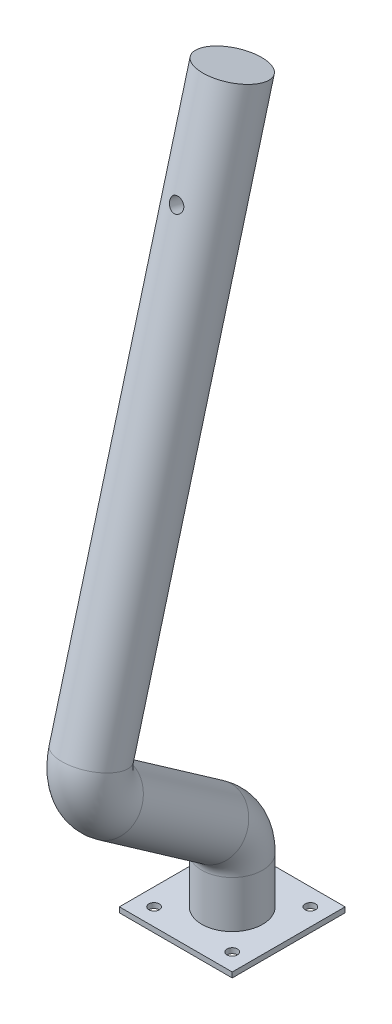
ISO-10303-21;
HEADER;
FILE_DESCRIPTION(('STEP AP214'),'2;1');
FILE_NAME('part.step','',(''),(''),'','','');
FILE_SCHEMA(('AUTOMOTIVE_DESIGN { 1 0 10303 214 1 1 1 1 }'));
ENDSEC;
DATA;
#1=APPLICATION_CONTEXT('core data for automotive mechanical design processes');
#2=APPLICATION_PROTOCOL_DEFINITION('international standard','automotive_design',2000,#1);
#3=PRODUCT_CONTEXT('',#1,'mechanical');
#4=PRODUCT('Part','Part','',(#3));
#5=PRODUCT_RELATED_PRODUCT_CATEGORY('part','',(#4));
#6=PRODUCT_DEFINITION_FORMATION('','',#4);
#7=PRODUCT_DEFINITION_CONTEXT('part definition',#1,'design');
#8=PRODUCT_DEFINITION('design','',#6,#7);
#9=PRODUCT_DEFINITION_SHAPE('','',#8);
#10=(LENGTH_UNIT() NAMED_UNIT(*) SI_UNIT(.MILLI.,.METRE.));
#11=(NAMED_UNIT(*) PLANE_ANGLE_UNIT() SI_UNIT($,.RADIAN.));
#12=(NAMED_UNIT(*) SI_UNIT($,.STERADIAN.) SOLID_ANGLE_UNIT());
#13=UNCERTAINTY_MEASURE_WITH_UNIT(LENGTH_MEASURE(1.E-05),#10,'distance_accuracy_value','');
#14=(GEOMETRIC_REPRESENTATION_CONTEXT(3) GLOBAL_UNCERTAINTY_ASSIGNED_CONTEXT((#13)) GLOBAL_UNIT_ASSIGNED_CONTEXT((#10,
#11,#12)) REPRESENTATION_CONTEXT('',''));
#15=CARTESIAN_POINT('',(0.,0.,0.));
#16=DIRECTION('',(0.,0.,1.));
#17=DIRECTION('',(1.,0.,0.));
#18=AXIS2_PLACEMENT_3D('',#15,#16,#17);
#19=CARTESIAN_POINT('',(0.,3.,0.));
#20=DIRECTION('',(0.,-1.,0.));
#21=DIRECTION('',(0.,0.,-1.));
#22=AXIS2_PLACEMENT_3D('',#19,#20,#21);
#23=PLANE('',#22);
#24=CARTESIAN_POINT('',(0.,3.,0.));
#25=DIRECTION('',(0.,-1.,0.));
#26=DIRECTION('',(0.,0.,-1.));
#27=AXIS2_PLACEMENT_3D('',#24,#25,#26);
#28=CIRCLE('',#27,17.5);
#29=CARTESIAN_POINT('',(0.,3.,-17.5));
#30=VERTEX_POINT('',#29);
#31=EDGE_CURVE('E12',#30,#30,#28,.F.);
#32=ORIENTED_EDGE('',*,*,#31,.F.);
#33=EDGE_LOOP('',(#32));
#34=FACE_BOUND('',#33,.T.);
#35=DIRECTION('',(0.,0.,-1.));
#36=VECTOR('',#35,1.);
#37=CARTESIAN_POINT('',(32.5,3.,32.5));
#38=LINE('',#37,#36);
#39=CARTESIAN_POINT('',(32.5,3.,32.5));
#40=VERTEX_POINT('',#39);
#41=CARTESIAN_POINT('',(32.5,3.,-32.5));
#42=VERTEX_POINT('',#41);
#43=EDGE_CURVE('E142',#40,#42,#38,.T.);
#44=ORIENTED_EDGE('',*,*,#43,.T.);
#45=DIRECTION('',(-1.,0.,0.));
#46=VECTOR('',#45,1.);
#47=CARTESIAN_POINT('',(-32.5,3.,-32.5));
#48=LINE('',#47,#46);
#49=CARTESIAN_POINT('',(-32.5,3.,-32.5));
#50=VERTEX_POINT('',#49);
#51=EDGE_CURVE('E101',#42,#50,#48,.T.);
#52=ORIENTED_EDGE('',*,*,#51,.T.);
#53=DIRECTION('',(0.,0.,1.));
#54=VECTOR('',#53,1.);
#55=CARTESIAN_POINT('',(-32.5,3.,32.5));
#56=LINE('',#55,#54);
#57=CARTESIAN_POINT('',(-32.5,3.,32.5));
#58=VERTEX_POINT('',#57);
#59=EDGE_CURVE('E145',#50,#58,#56,.T.);
#60=ORIENTED_EDGE('',*,*,#59,.T.);
#61=DIRECTION('',(1.,0.,0.));
#62=VECTOR('',#61,1.);
#63=CARTESIAN_POINT('',(-32.5,3.,32.5));
#64=LINE('',#63,#62);
#65=EDGE_CURVE('E69',#58,#40,#64,.T.);
#66=ORIENTED_EDGE('',*,*,#65,.T.);
#67=EDGE_LOOP('',(#44,#52,#60,#66));
#68=FACE_BOUND('',#67,.T.);
#69=CARTESIAN_POINT('',(22.5,3.,22.5));
#70=DIRECTION('',(0.,1.,0.));
#71=DIRECTION('',(0.,0.,1.));
#72=AXIS2_PLACEMENT_3D('',#69,#70,#71);
#73=CIRCLE('',#72,3.);
#74=CARTESIAN_POINT('',(22.5,3.,25.5));
#75=VERTEX_POINT('',#74);
#76=EDGE_CURVE('E136',#75,#75,#73,.T.);
#77=ORIENTED_EDGE('',*,*,#76,.F.);
#78=EDGE_LOOP('',(#77));
#79=FACE_BOUND('',#78,.T.);
#80=CARTESIAN_POINT('',(-22.5,3.,22.5));
#81=DIRECTION('',(0.,1.,0.));
#82=DIRECTION('',(0.,0.,1.));
#83=AXIS2_PLACEMENT_3D('',#80,#81,#82);
#84=CIRCLE('',#83,3.);
#85=CARTESIAN_POINT('',(-22.5,3.,25.5));
#86=VERTEX_POINT('',#85);
#87=EDGE_CURVE('E130',#86,#86,#84,.T.);
#88=ORIENTED_EDGE('',*,*,#87,.F.);
#89=EDGE_LOOP('',(#88));
#90=FACE_BOUND('',#89,.T.);
#91=CARTESIAN_POINT('',(-22.5,3.,-22.5));
#92=DIRECTION('',(0.,1.,0.));
#93=DIRECTION('',(0.,0.,1.));
#94=AXIS2_PLACEMENT_3D('',#91,#92,#93);
#95=CIRCLE('',#94,3.);
#96=CARTESIAN_POINT('',(-22.5,3.,-19.5));
#97=VERTEX_POINT('',#96);
#98=EDGE_CURVE('E124',#97,#97,#95,.T.);
#99=ORIENTED_EDGE('',*,*,#98,.F.);
#100=EDGE_LOOP('',(#99));
#101=FACE_BOUND('',#100,.T.);
#102=CARTESIAN_POINT('',(22.5,3.,-22.5));
#103=DIRECTION('',(0.,1.,0.));
#104=DIRECTION('',(0.,0.,1.));
#105=AXIS2_PLACEMENT_3D('',#102,#103,#104);
#106=CIRCLE('',#105,3.);
#107=CARTESIAN_POINT('',(22.5,3.,-19.5));
#108=VERTEX_POINT('',#107);
#109=EDGE_CURVE('E114',#108,#108,#106,.T.);
#110=ORIENTED_EDGE('',*,*,#109,.F.);
#111=EDGE_LOOP('',(#110));
#112=FACE_BOUND('',#111,.T.);
#113=ADVANCED_FACE('F47',(#34,#68,#79,#90,#101,#112),#23,.F.);
#114=CARTESIAN_POINT('',(0.,0.,0.));
#115=DIRECTION('',(0.,-1.,0.));
#116=DIRECTION('',(0.,0.,-1.));
#117=AXIS2_PLACEMENT_3D('',#114,#115,#116);
#118=PLANE('',#117);
#119=CARTESIAN_POINT('',(-22.5,0.,-22.5));
#120=DIRECTION('',(0.,1.,0.));
#121=DIRECTION('',(0.,0.,1.));
#122=AXIS2_PLACEMENT_3D('',#119,#120,#121);
#123=CIRCLE('',#122,3.);
#124=CARTESIAN_POINT('',(-22.5,0.,-19.5));
#125=VERTEX_POINT('',#124);
#126=EDGE_CURVE('E122',#125,#125,#123,.T.);
#127=ORIENTED_EDGE('',*,*,#126,.T.);
#128=EDGE_LOOP('',(#127));
#129=FACE_BOUND('',#128,.T.);
#130=CARTESIAN_POINT('',(22.5,0.,22.5));
#131=DIRECTION('',(0.,1.,0.));
#132=DIRECTION('',(0.,0.,1.));
#133=AXIS2_PLACEMENT_3D('',#130,#131,#132);
#134=CIRCLE('',#133,3.);
#135=CARTESIAN_POINT('',(22.5,0.,25.5));
#136=VERTEX_POINT('',#135);
#137=EDGE_CURVE('E133',#136,#136,#134,.T.);
#138=ORIENTED_EDGE('',*,*,#137,.T.);
#139=EDGE_LOOP('',(#138));
#140=FACE_BOUND('',#139,.T.);
#141=DIRECTION('',(0.,0.,-1.));
#142=VECTOR('',#141,1.);
#143=CARTESIAN_POINT('',(32.5,0.,32.5));
#144=LINE('',#143,#142);
#145=CARTESIAN_POINT('',(32.5,0.,32.5));
#146=VERTEX_POINT('',#145);
#147=CARTESIAN_POINT('',(32.5,0.,-32.5));
#148=VERTEX_POINT('',#147);
#149=EDGE_CURVE('E139',#146,#148,#144,.T.);
#150=ORIENTED_EDGE('',*,*,#149,.F.);
#151=DIRECTION('',(1.,0.,0.));
#152=VECTOR('',#151,1.);
#153=CARTESIAN_POINT('',(-32.5,0.,32.5));
#154=LINE('',#153,#152);
#155=CARTESIAN_POINT('',(-32.5,0.,32.5));
#156=VERTEX_POINT('',#155);
#157=EDGE_CURVE('E93',#156,#146,#154,.T.);
#158=ORIENTED_EDGE('',*,*,#157,.F.);
#159=DIRECTION('',(0.,0.,1.));
#160=VECTOR('',#159,1.);
#161=CARTESIAN_POINT('',(-32.5,0.,32.5));
#162=LINE('',#161,#160);
#163=CARTESIAN_POINT('',(-32.5,0.,-32.5));
#164=VERTEX_POINT('',#163);
#165=EDGE_CURVE('E87',#164,#156,#162,.T.);
#166=ORIENTED_EDGE('',*,*,#165,.F.);
#167=DIRECTION('',(-1.,0.,0.));
#168=VECTOR('',#167,1.);
#169=CARTESIAN_POINT('',(-32.5,0.,-32.5));
#170=LINE('',#169,#168);
#171=EDGE_CURVE('E151',#148,#164,#170,.T.);
#172=ORIENTED_EDGE('',*,*,#171,.F.);
#173=EDGE_LOOP('',(#150,#158,#166,#172));
#174=FACE_BOUND('',#173,.T.);
#175=CARTESIAN_POINT('',(-22.5,0.,22.5));
#176=DIRECTION('',(0.,1.,0.));
#177=DIRECTION('',(0.,0.,1.));
#178=AXIS2_PLACEMENT_3D('',#175,#176,#177);
#179=CIRCLE('',#178,3.);
#180=CARTESIAN_POINT('',(-22.5,0.,25.5));
#181=VERTEX_POINT('',#180);
#182=EDGE_CURVE('E127',#181,#181,#179,.T.);
#183=ORIENTED_EDGE('',*,*,#182,.T.);
#184=EDGE_LOOP('',(#183));
#185=FACE_BOUND('',#184,.T.);
#186=CARTESIAN_POINT('',(22.5,0.,-22.5));
#187=DIRECTION('',(0.,1.,0.));
#188=DIRECTION('',(0.,0.,1.));
#189=AXIS2_PLACEMENT_3D('',#186,#187,#188);
#190=CIRCLE('',#189,3.);
#191=CARTESIAN_POINT('',(22.5,0.,-19.5));
#192=VERTEX_POINT('',#191);
#193=EDGE_CURVE('E110',#192,#192,#190,.T.);
#194=ORIENTED_EDGE('',*,*,#193,.T.);
#195=EDGE_LOOP('',(#194));
#196=FACE_BOUND('',#195,.T.);
#197=ADVANCED_FACE('F166',(#129,#140,#174,#185,#196),#118,.T.);
#198=CARTESIAN_POINT('',(32.5,3.,32.5));
#199=DIRECTION('',(-1.,0.,0.));
#200=DIRECTION('',(0.,0.,1.));
#201=AXIS2_PLACEMENT_3D('',#198,#199,#200);
#202=PLANE('',#201);
#203=ORIENTED_EDGE('',*,*,#149,.T.);
#204=DIRECTION('',(0.,-1.,0.));
#205=VECTOR('',#204,1.);
#206=CARTESIAN_POINT('',(32.5,3.,-32.5));
#207=LINE('',#206,#205);
#208=EDGE_CURVE('E61',#42,#148,#207,.T.);
#209=ORIENTED_EDGE('',*,*,#208,.F.);
#210=ORIENTED_EDGE('',*,*,#43,.F.);
#211=DIRECTION('',(0.,-1.,0.));
#212=VECTOR('',#211,1.);
#213=CARTESIAN_POINT('',(32.5,3.,32.5));
#214=LINE('',#213,#212);
#215=EDGE_CURVE('E148',#40,#146,#214,.T.);
#216=ORIENTED_EDGE('',*,*,#215,.T.);
#217=EDGE_LOOP('',(#203,#209,#210,#216));
#218=FACE_BOUND('',#217,.T.);
#219=ADVANCED_FACE('F49',(#218),#202,.F.);
#220=CARTESIAN_POINT('',(-32.5,3.,-32.5));
#221=DIRECTION('',(0.,0.,1.));
#222=DIRECTION('',(1.,0.,0.));
#223=AXIS2_PLACEMENT_3D('',#220,#221,#222);
#224=PLANE('',#223);
#225=ORIENTED_EDGE('',*,*,#171,.T.);
#226=DIRECTION('',(0.,-1.,0.));
#227=VECTOR('',#226,1.);
#228=CARTESIAN_POINT('',(-32.5,3.,-32.5));
#229=LINE('',#228,#227);
#230=EDGE_CURVE('E158',#50,#164,#229,.T.);
#231=ORIENTED_EDGE('',*,*,#230,.F.);
#232=ORIENTED_EDGE('',*,*,#51,.F.);
#233=ORIENTED_EDGE('',*,*,#208,.T.);
#234=EDGE_LOOP('',(#225,#231,#232,#233));
#235=FACE_BOUND('',#234,.T.);
#236=ADVANCED_FACE('F161',(#235),#224,.F.);
#237=CARTESIAN_POINT('',(-32.5,3.,32.5));
#238=DIRECTION('',(1.,0.,0.));
#239=DIRECTION('',(0.,0.,-1.));
#240=AXIS2_PLACEMENT_3D('',#237,#238,#239);
#241=PLANE('',#240);
#242=ORIENTED_EDGE('',*,*,#165,.T.);
#243=DIRECTION('',(0.,-1.,0.));
#244=VECTOR('',#243,1.);
#245=CARTESIAN_POINT('',(-32.5,3.,32.5));
#246=LINE('',#245,#244);
#247=EDGE_CURVE('E156',#58,#156,#246,.T.);
#248=ORIENTED_EDGE('',*,*,#247,.F.);
#249=ORIENTED_EDGE('',*,*,#59,.F.);
#250=ORIENTED_EDGE('',*,*,#230,.T.);
#251=EDGE_LOOP('',(#242,#248,#249,#250));
#252=FACE_BOUND('',#251,.T.);
#253=ADVANCED_FACE('F208',(#252),#241,.F.);
#254=CARTESIAN_POINT('',(-32.5,3.,32.5));
#255=DIRECTION('',(0.,0.,-1.));
#256=DIRECTION('',(-1.,0.,0.));
#257=AXIS2_PLACEMENT_3D('',#254,#255,#256);
#258=PLANE('',#257);
#259=ORIENTED_EDGE('',*,*,#157,.T.);
#260=ORIENTED_EDGE('',*,*,#215,.F.);
#261=ORIENTED_EDGE('',*,*,#65,.F.);
#262=ORIENTED_EDGE('',*,*,#247,.T.);
#263=EDGE_LOOP('',(#259,#260,#261,#262));
#264=FACE_BOUND('',#263,.T.);
#265=ADVANCED_FACE('F205',(#264),#258,.F.);
#266=CARTESIAN_POINT('',(22.5,3.,22.5));
#267=DIRECTION('',(0.,-1.,0.));
#268=DIRECTION('',(0.,0.,-1.));
#269=AXIS2_PLACEMENT_3D('',#266,#267,#268);
#270=CYLINDRICAL_SURFACE('',#269,3.);
#271=ORIENTED_EDGE('',*,*,#76,.T.);
#272=EDGE_LOOP('',(#271));
#273=FACE_BOUND('',#272,.T.);
#274=ORIENTED_EDGE('',*,*,#137,.F.);
#275=EDGE_LOOP('',(#274));
#276=FACE_BOUND('',#275,.T.);
#277=ADVANCED_FACE('F202',(#273,#276),#270,.F.);
#278=CARTESIAN_POINT('',(-22.5,3.,22.5));
#279=DIRECTION('',(0.,-1.,0.));
#280=DIRECTION('',(0.,0.,-1.));
#281=AXIS2_PLACEMENT_3D('',#278,#279,#280);
#282=CYLINDRICAL_SURFACE('',#281,3.);
#283=ORIENTED_EDGE('',*,*,#87,.T.);
#284=EDGE_LOOP('',(#283));
#285=FACE_BOUND('',#284,.T.);
#286=ORIENTED_EDGE('',*,*,#182,.F.);
#287=EDGE_LOOP('',(#286));
#288=FACE_BOUND('',#287,.T.);
#289=ADVANCED_FACE('F188',(#285,#288),#282,.F.);
#290=CARTESIAN_POINT('',(-22.5,3.,-22.5));
#291=DIRECTION('',(0.,-1.,0.));
#292=DIRECTION('',(0.,0.,-1.));
#293=AXIS2_PLACEMENT_3D('',#290,#291,#292);
#294=CYLINDRICAL_SURFACE('',#293,3.);
#295=ORIENTED_EDGE('',*,*,#98,.T.);
#296=EDGE_LOOP('',(#295));
#297=FACE_BOUND('',#296,.T.);
#298=ORIENTED_EDGE('',*,*,#126,.F.);
#299=EDGE_LOOP('',(#298));
#300=FACE_BOUND('',#299,.T.);
#301=ADVANCED_FACE('F178',(#297,#300),#294,.F.);
#302=CARTESIAN_POINT('',(22.5,3.,-22.5));
#303=DIRECTION('',(0.,-1.,0.));
#304=DIRECTION('',(0.,0.,-1.));
#305=AXIS2_PLACEMENT_3D('',#302,#303,#304);
#306=CYLINDRICAL_SURFACE('',#305,3.);
#307=ORIENTED_EDGE('',*,*,#109,.T.);
#308=EDGE_LOOP('',(#307));
#309=FACE_BOUND('',#308,.T.);
#310=ORIENTED_EDGE('',*,*,#193,.F.);
#311=EDGE_LOOP('',(#310));
#312=FACE_BOUND('',#311,.T.);
#313=ADVANCED_FACE('F175',(#309,#312),#306,.F.);
#314=CARTESIAN_POINT('',(0.,422.795255313389,0.));
#315=DIRECTION('',(0.,-0.965925826289068,0.258819045102521));
#316=DIRECTION('',(0.,-0.258819045102521,-0.965925826289068));
#317=AXIS2_PLACEMENT_3D('',#314,#315,#316);
#318=PLANE('',#317);
#319=CARTESIAN_POINT('',(0.,422.795255313389,0.));
#320=DIRECTION('',(0.,-0.965925826289068,0.258819045102521));
#321=DIRECTION('',(0.,-0.258819045102521,-0.965925826289068));
#322=AXIS2_PLACEMENT_3D('',#319,#320,#321);
#323=CIRCLE('',#322,17.5);
#324=CARTESIAN_POINT('',(0.,418.265922024095,-16.9037019600587));
#325=VERTEX_POINT('',#324);
#326=EDGE_CURVE('E106',#325,#325,#323,.T.);
#327=ORIENTED_EDGE('',*,*,#326,.F.);
#328=EDGE_LOOP('',(#327));
#329=FACE_BOUND('',#328,.T.);
#330=ADVANCED_FACE('F177',(#329),#318,.F.);
#331=CARTESIAN_POINT('',(0.,3.00000000000011,0.));
#332=DIRECTION('',(0.,1.,0.));
#333=DIRECTION('',(0.,0.,1.));
#334=AXIS2_PLACEMENT_3D('',#331,#332,#333);
#335=CYLINDRICAL_SURFACE('',#334,17.5);
#336=CARTESIAN_POINT('',(0.,29.9858237362064,0.));
#337=DIRECTION('',(0.,-1.,0.));
#338=DIRECTION('',(0.,0.,-1.));
#339=AXIS2_PLACEMENT_3D('',#336,#337,#338);
#340=CIRCLE('',#339,17.5);
#341=CARTESIAN_POINT('',(0.,29.9858237362065,-17.4999999999999));
#342=VERTEX_POINT('',#341);
#343=EDGE_CURVE('E341',#342,#342,#340,.T.);
#344=ORIENTED_EDGE('',*,*,#343,.T.);
#345=EDGE_LOOP('',(#344));
#346=FACE_BOUND('',#345,.T.);
#347=ORIENTED_EDGE('',*,*,#31,.T.);
#348=EDGE_LOOP('',(#347));
#349=FACE_BOUND('',#348,.T.);
#350=ADVANCED_FACE('F185',(#346,#349),#335,.T.);
#351=CARTESIAN_POINT('',(0.,29.9858237362063,25.));
#352=DIRECTION('',(1.,0.,0.));
#353=DIRECTION('',(0.,0.,-1.));
#354=AXIS2_PLACEMENT_3D('',#351,#352,#353);
#355=TOROIDAL_SURFACE('',#354,24.9999999999999,17.5);
#356=CARTESIAN_POINT('',(0.,50.4646248434312,10.660589091224));
#357=DIRECTION('',(0.,-0.573576436351044,-0.819152044288993));
#358=DIRECTION('',(0.,0.819152044288993,-0.573576436351044));
#359=AXIS2_PLACEMENT_3D('',#356,#357,#358);
#360=CIRCLE('',#359,17.5);
#361=CARTESIAN_POINT('',(0.,64.7997856184885,0.623001455080759));
#362=VERTEX_POINT('',#361);
#363=EDGE_CURVE('E345',#362,#362,#360,.T.);
#364=CARTESIAN_POINT('',(0.,29.9858237362063,25.));
#365=DIRECTION('',(1.,0.,0.));
#366=DIRECTION('',(0.,0.,-1.));
#367=AXIS2_PLACEMENT_3D('',#364,#365,#366);
#368=CIRCLE('',#367,42.5);
#369=EDGE_CURVE('',#342,#362,#368,.T.);
#370=ORIENTED_EDGE('',*,*,#343,.F.);
#371=ORIENTED_EDGE('',*,*,#363,.T.);
#372=ORIENTED_EDGE('',*,*,#369,.T.);
#373=ORIENTED_EDGE('',*,*,#369,.F.);
#374=EDGE_LOOP('',(#370,#372,#371,#373));
#375=FACE_BOUND('',#374,.T.);
#376=ADVANCED_FACE('F277',(#375),#355,.T.);
#377=CARTESIAN_POINT('',(0.,50.4646248434311,10.6605890912241));
#378=DIRECTION('',(0.,0.573576436351044,0.819152044288993));
#379=DIRECTION('',(0.,-0.819152044288993,0.573576436351044));
#380=AXIS2_PLACEMENT_3D('',#377,#378,#379);
#381=CYLINDRICAL_SURFACE('',#380,17.5);
#382=CARTESIAN_POINT('',(0.,92.9594363881884,71.3494694957513));
#383=DIRECTION('',(0.,-0.573576436351044,-0.819152044288993));
#384=DIRECTION('',(0.,0.819152044288994,-0.573576436351044));
#385=AXIS2_PLACEMENT_3D('',#382,#383,#384);
#386=CIRCLE('',#385,17.5);
#387=CARTESIAN_POINT('',(0.,78.6242756131311,81.3870571318947));
#388=VERTEX_POINT('',#387);
#389=EDGE_CURVE('E117',#388,#388,#386,.T.);
#390=ORIENTED_EDGE('',*,*,#389,.T.);
#391=EDGE_LOOP('',(#390));
#392=FACE_BOUND('',#391,.T.);
#393=ORIENTED_EDGE('',*,*,#363,.F.);
#394=EDGE_LOOP('',(#393));
#395=FACE_BOUND('',#394,.T.);
#396=ADVANCED_FACE('F286',(#392,#395),#381,.T.);
#397=CARTESIAN_POINT('',(0.,113.438237495413,57.010058586975));
#398=DIRECTION('',(-1.,0.,0.));
#399=DIRECTION('',(0.,0.,1.));
#400=AXIS2_PLACEMENT_3D('',#397,#398,#399);
#401=TOROIDAL_SURFACE('',#400,25.,17.5);
#402=CARTESIAN_POINT('',(0.,119.908713622976,81.158204244202));
#403=DIRECTION('',(0.,-0.965925826289068,0.258819045102521));
#404=DIRECTION('',(0.,-0.258819045102521,-0.965925826289068));
#405=AXIS2_PLACEMENT_3D('',#402,#403,#404);
#406=CIRCLE('',#405,17.5);
#407=CARTESIAN_POINT('',(0.,124.438046912271,98.0619062042604));
#408=VERTEX_POINT('',#407);
#409=EDGE_CURVE('E111',#408,#408,#406,.T.);
#410=CARTESIAN_POINT('',(0.,113.438237495413,57.010058586975));
#411=DIRECTION('',(-1.,0.,0.));
#412=DIRECTION('',(0.,0.,1.));
#413=AXIS2_PLACEMENT_3D('',#410,#411,#412);
#414=CIRCLE('',#413,42.5);
#415=EDGE_CURVE('',#388,#408,#414,.T.);
#416=ORIENTED_EDGE('',*,*,#389,.F.);
#417=ORIENTED_EDGE('',*,*,#409,.T.);
#418=ORIENTED_EDGE('',*,*,#415,.T.);
#419=ORIENTED_EDGE('',*,*,#415,.F.);
#420=EDGE_LOOP('',(#416,#418,#417,#419));
#421=FACE_BOUND('',#420,.T.);
#422=ADVANCED_FACE('F192',(#421),#401,.T.);
#423=CARTESIAN_POINT('',(0.,119.908713622976,81.1582042442017));
#424=DIRECTION('',(0.,0.965925826289068,-0.258819045102521));
#425=DIRECTION('',(0.,0.258819045102521,0.965925826289068));
#426=AXIS2_PLACEMENT_3D('',#423,#424,#425);
#427=CYLINDRICAL_SURFACE('',#426,17.5);
#428=CARTESIAN_POINT('',(0.,365.505335720183,33.46812084662));
#429=CARTESIAN_POINT('',(-0.221594935282785,365.50534162977,33.4681150889878));
#430=CARTESIAN_POINT('',(-0.443274756959133,365.522082032576,33.4592322461729));
#431=CARTESIAN_POINT('',(-0.880320521290676,365.588606534483,33.4242905996561));
#432=CARTESIAN_POINT('',(-1.09568213303245,365.638412770852,33.3982202891858));
#433=CARTESIAN_POINT('',(-1.51371360660755,365.769663137966,33.3306948776476));
#434=CARTESIAN_POINT('',(-1.71639705154227,365.851072711335,33.2892565832487));
#435=CARTESIAN_POINT('',(-2.10389021634724,366.043487398208,33.1936520013137));
#436=CARTESIAN_POINT('',(-2.28870007051437,366.154492289318,33.1394858094218));
#437=CARTESIAN_POINT('',(-2.63842568761193,366.405480105128,33.0207832058104));
#438=CARTESIAN_POINT('',(-2.80298539706787,366.545888798948,32.9560979535884));
#439=CARTESIAN_POINT('',(-3.10444991151438,366.851397215645,32.8207966628016));
#440=CARTESIAN_POINT('',(-3.24135206502981,367.01649930319,32.7501800565275));
#441=CARTESIAN_POINT('',(-3.48521732049749,367.369762399225,32.6060950960134));
#442=CARTESIAN_POINT('',(-3.591795585415,367.558179697486,32.532602488061));
#443=CARTESIAN_POINT('',(-3.76951731339886,367.951739367891,32.3875689627826));
#444=CARTESIAN_POINT('',(-3.84066543543488,368.156879536893,32.3160277900182));
#445=CARTESIAN_POINT('',(-3.94431902613061,368.574755354284,32.1795750001735));
#446=CARTESIAN_POINT('',(-3.97745793088179,368.787303769902,32.1145716956283));
#447=CARTESIAN_POINT('',(-4.00612307635682,369.21713438419,31.9924474192658));
#448=CARTESIAN_POINT('',(-4.00165438345225,369.434415941292,31.9353253867632));
#449=CARTESIAN_POINT('',(-3.95573961410787,369.862899541462,31.8316088039249));
#450=CARTESIAN_POINT('',(-3.91503498212017,370.074136254501,31.7848265285118));
#451=CARTESIAN_POINT('',(-3.7989808959904,370.488846702945,31.7008514690643));
#452=CARTESIAN_POINT('',(-3.72362933860985,370.692319966258,31.6636592674086));
#453=CARTESIAN_POINT('',(-3.53975448878011,371.087390765782,31.5981860735508));
#454=CARTESIAN_POINT('',(-3.43095096279257,371.278870866326,31.5699846271913));
#455=CARTESIAN_POINT('',(-3.18345740925707,371.642596589016,31.5218325467407));
#456=CARTESIAN_POINT('',(-3.0447629550435,371.814839356486,31.501883136005));
#457=CARTESIAN_POINT('',(-2.73752505065931,372.138957009841,31.4683477536541));
#458=CARTESIAN_POINT('',(-2.5683525134257,372.290252957949,31.4549236656509));
#459=CARTESIAN_POINT('',(-2.20701546217961,372.562811116058,31.4334102562064));
#460=CARTESIAN_POINT('',(-2.01485045400196,372.684072680373,31.4253210494493));
#461=CARTESIAN_POINT('',(-1.61221242808027,372.892792585246,31.4128289446142));
#462=CARTESIAN_POINT('',(-1.40169500928062,372.980165992929,31.4084352767917));
#463=CARTESIAN_POINT('',(-0.968760585223068,373.117502337259,31.4020582843081));
#464=CARTESIAN_POINT('',(-0.746345479589449,373.167471227047,31.4000745760569));
#465=CARTESIAN_POINT('',(-0.301080239392931,373.227438959988,31.3977437377913));
#466=CARTESIAN_POINT('',(-0.0783432719554306,373.238277844577,31.3973621831273));
#467=CARTESIAN_POINT('',(0.365714036026675,373.221914359528,31.3979715184254));
#468=CARTESIAN_POINT('',(0.587034480772294,373.194714821113,31.398962306243));
#469=CARTESIAN_POINT('',(1.01921828270223,373.103865073613,31.4027186065097));
#470=CARTESIAN_POINT('',(1.23017576869971,373.040659911422,31.4054624991724));
#471=CARTESIAN_POINT('',(1.63873374864026,372.880361091356,31.4136295186363));
#472=CARTESIAN_POINT('',(1.83633303329062,372.783264370235,31.4190528876373));
#473=CARTESIAN_POINT('',(2.21591921812756,372.556630987282,31.434008335949));
#474=CARTESIAN_POINT('',(2.39761969440067,372.426618958441,31.4436022451837));
#475=CARTESIAN_POINT('',(2.73724492155051,372.138996278553,31.4685254510682));
#476=CARTESIAN_POINT('',(2.89516627399102,371.981381689585,31.4838555664292));
#477=CARTESIAN_POINT('',(3.18603583539191,371.639777947004,31.5222881522755));
#478=CARTESIAN_POINT('',(3.31841356091017,371.455319327759,31.5455417311292));
#479=CARTESIAN_POINT('',(3.55036421684566,371.068062420535,31.6012495868124));
#480=CARTESIAN_POINT('',(3.64993860087587,370.865264945713,31.6337034558312));
#481=CARTESIAN_POINT('',(3.81275583687654,370.44868079155,31.7085407820342));
#482=CARTESIAN_POINT('',(3.87620881551102,370.234965717504,31.7508647487682));
#483=CARTESIAN_POINT('',(3.9655823692015,369.802006631623,31.845606763901));
#484=CARTESIAN_POINT('',(3.99150958975623,369.58276360574,31.8980230231756));
#485=CARTESIAN_POINT('',(4.00479284917439,369.150702491297,32.0105655635401));
#486=CARTESIAN_POINT('',(3.99305540805985,368.937856023961,32.0704777770634));
#487=CARTESIAN_POINT('',(3.93338362127889,368.519354929138,32.1969775113753));
#488=CARTESIAN_POINT('',(3.8854497862498,368.313700200237,32.2635649379824));
#489=CARTESIAN_POINT('',(3.75520174667948,367.915923044091,32.4003095216768));
#490=CARTESIAN_POINT('',(3.67303100198934,367.723748014719,32.4704507228224));
#491=CARTESIAN_POINT('',(3.47676086584628,367.356657897869,32.6112121172307));
#492=CARTESIAN_POINT('',(3.36265780165957,367.181744798924,32.6818323646792));
#493=CARTESIAN_POINT('',(3.10280513424772,366.849515147104,32.8214384895049));
#494=CARTESIAN_POINT('',(2.95641450406337,366.692670403714,32.8903542253792));
#495=CARTESIAN_POINT('',(2.63742660785007,366.404666145215,33.0209894656119));
#496=CARTESIAN_POINT('',(2.46482325514101,366.273512611928,33.0827072926922));
#497=CARTESIAN_POINT('',(2.09530030913023,366.038249041077,33.1960451122937));
#498=CARTESIAN_POINT('',(1.89806528208061,365.934557333266,33.2475062402813));
#499=CARTESIAN_POINT('',(1.48683089541921,365.759429647363,33.3357906658689));
#500=CARTESIAN_POINT('',(1.27284515414195,365.687967779556,33.3726257095129));
#501=CARTESIAN_POINT('',(0.882343223138206,365.591060209294,33.4229826955352));
#502=CARTESIAN_POINT('',(0.707870008416512,365.558968062302,33.4398417499792));
#503=CARTESIAN_POINT('',(0.355615969967494,365.516104005913,33.462412843335));
#504=CARTESIAN_POINT('',(0.177835320323118,365.505330977596,33.4681254672598));
#505=CARTESIAN_POINT('',(0.,365.505335720183,33.46812084662));
#506=B_SPLINE_CURVE_WITH_KNOTS('',3,(#428,#429,#430,#431,#432,#433,#434,#435,#436,#437,#438,
#439,#440,#441,#442,#443,#444,#445,#446,#447,#448,#449,#450,#451,#452,#453,#454,#455,#456,#457,
#458,#459,#460,#461,#462,#463,#464,#465,#466,#467,#468,#469,#470,#471,#472,#473,#474,#475,#476,
#477,#478,#479,#480,#481,#482,#483,#484,#485,#486,#487,#488,#489,#490,#491,#492,#493,#494,#495,
#496,#497,#498,#499,#500,#501,#502,#503,#504,#505),.UNSPECIFIED.,.T.,.F.,(4,2,2,2,2,2,2,2,2,2,2,
2,2,2,2,2,2,2,2,2,2,2,2,2,2,2,2,2,2,2,2,2,2,2,2,2,2,2,4),(0.,0.664133636950418,1.32871235418462,
1.99256641063921,2.65641547870267,3.33063948245776,4.00492809209304,4.68742689490875,
5.36983592723057,6.04069914231532,6.71147198236622,7.36882739236743,8.02622271233901,
8.68928255518436,9.35244066073911,10.0313033386906,10.7101806097054,11.3907485024341,
12.071208055884,12.7369696485043,13.4026816907039,14.0603384109987,14.7180545882069,
15.3858732303227,16.0537872245364,16.7352268957805,17.4166363663564,18.0940403124227,
18.7713242812164,19.4324306212132,20.0935276348865,20.7518819365842,21.4103119908292,
22.0832282229975,22.7563009481091,23.4391031988251,24.1213559842544,24.6543673418572,
25.1873507239626),.UNSPECIFIED.);
#507=CARTESIAN_POINT('',(0.,365.505335720183,33.46812084662));
#508=VERTEX_POINT('',#507);
#509=EDGE_CURVE('E51',#508,#508,#506,.T.);
#510=ORIENTED_EDGE('',*,*,#509,.T.);
#511=EDGE_LOOP('',(#510));
#512=FACE_BOUND('',#511,.T.);
#513=ORIENTED_EDGE('',*,*,#326,.T.);
#514=EDGE_LOOP('',(#513));
#515=FACE_BOUND('',#514,.T.);
#516=ORIENTED_EDGE('',*,*,#409,.F.);
#517=EDGE_LOOP('',(#516));
#518=FACE_BOUND('',#517,.T.);
#519=ADVANCED_FACE('F107',(#512,#515,#518),#427,.T.);
#520=CARTESIAN_POINT('',(0.,377.780657991171,63.8254340206047));
#521=DIRECTION('',(0.,-0.258819045102521,-0.965925826289068));
#522=DIRECTION('',(0.,0.965925826289068,-0.258819045102521));
#523=AXIS2_PLACEMENT_3D('',#520,#521,#522);
#524=CYLINDRICAL_SURFACE('',#523,3.99999999999999);
#525=CARTESIAN_POINT('',(0.,364.839705736045,15.5291427061513));
#526=DIRECTION('',(0.,-0.258819045102521,-0.965925826289068));
#527=DIRECTION('',(0.,0.965925826289068,-0.258819045102521));
#528=AXIS2_PLACEMENT_3D('',#525,#526,#527);
#529=CIRCLE('',#528,3.99999999999999);
#530=CARTESIAN_POINT('',(0.,368.703409041201,14.4938665257412));
#531=VERTEX_POINT('',#530);
#532=EDGE_CURVE('E338',#531,#531,#529,.T.);
#533=ORIENTED_EDGE('',*,*,#532,.T.);
#534=EDGE_LOOP('',(#533));
#535=FACE_BOUND('',#534,.T.);
#536=ORIENTED_EDGE('',*,*,#509,.F.);
#537=EDGE_LOOP('',(#536));
#538=FACE_BOUND('',#537,.T.);
#539=ADVANCED_FACE('F187',(#535,#538),#524,.F.);
#540=CARTESIAN_POINT('',(0.,364.839705736045,15.5291427061513));
#541=DIRECTION('',(0.,-0.258819045102521,-0.965925826289068));
#542=DIRECTION('',(0.,0.965925826289068,-0.258819045102521));
#543=AXIS2_PLACEMENT_3D('',#540,#541,#542);
#544=PLANE('',#543);
#545=ORIENTED_EDGE('',*,*,#532,.F.);
#546=EDGE_LOOP('',(#545));
#547=FACE_BOUND('',#546,.T.);
#548=ADVANCED_FACE('F316',(#547),#544,.F.);
#549=CLOSED_SHELL('',(#113,#197,#219,#236,#253,#265,#277,#289,#301,#313,#330,#350,#376,#396,
#422,#519,#539,#548));
#550=MANIFOLD_SOLID_BREP('B2',#549);
#551=ADVANCED_BREP_SHAPE_REPRESENTATION('',(#18,#550),#14);
#552=SHAPE_DEFINITION_REPRESENTATION(#9,#551);
ENDSEC;
END-ISO-10303-21;
